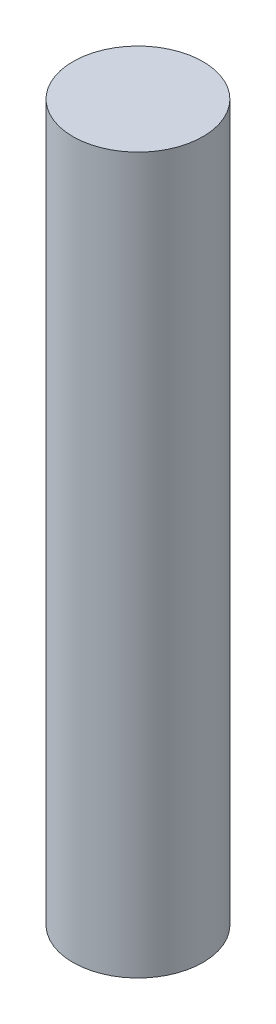
ISO-10303-21;
HEADER;
FILE_DESCRIPTION(('STEP AP214'),'2;1');
FILE_NAME('part.step','',(''),(''),'','','');
FILE_SCHEMA(('AUTOMOTIVE_DESIGN { 1 0 10303 214 1 1 1 1 }'));
ENDSEC;
DATA;
#1=APPLICATION_CONTEXT('core data for automotive mechanical design processes');
#2=APPLICATION_PROTOCOL_DEFINITION('international standard','automotive_design',2000,#1);
#3=PRODUCT_CONTEXT('',#1,'mechanical');
#4=PRODUCT('Part','Part','',(#3));
#5=PRODUCT_RELATED_PRODUCT_CATEGORY('part','',(#4));
#6=PRODUCT_DEFINITION_FORMATION('','',#4);
#7=PRODUCT_DEFINITION_CONTEXT('part definition',#1,'design');
#8=PRODUCT_DEFINITION('design','',#6,#7);
#9=PRODUCT_DEFINITION_SHAPE('','',#8);
#10=(LENGTH_UNIT() NAMED_UNIT(*) SI_UNIT(.MILLI.,.METRE.));
#11=(NAMED_UNIT(*) PLANE_ANGLE_UNIT() SI_UNIT($,.RADIAN.));
#12=(NAMED_UNIT(*) SI_UNIT($,.STERADIAN.) SOLID_ANGLE_UNIT());
#13=UNCERTAINTY_MEASURE_WITH_UNIT(LENGTH_MEASURE(1.E-05),#10,'distance_accuracy_value','');
#14=(GEOMETRIC_REPRESENTATION_CONTEXT(3) GLOBAL_UNCERTAINTY_ASSIGNED_CONTEXT((#13)) GLOBAL_UNIT_ASSIGNED_CONTEXT((#10,
#11,#12)) REPRESENTATION_CONTEXT('',''));
#15=CARTESIAN_POINT('',(0.,0.,0.));
#16=DIRECTION('',(0.,0.,1.));
#17=DIRECTION('',(1.,0.,0.));
#18=AXIS2_PLACEMENT_3D('',#15,#16,#17);
#19=CARTESIAN_POINT('',(0.,16.764,0.));
#20=DIRECTION('',(0.,-1.,0.));
#21=DIRECTION('',(0.,0.,-1.));
#22=AXIS2_PLACEMENT_3D('',#19,#20,#21);
#23=CYLINDRICAL_SURFACE('',#22,1.524);
#24=CARTESIAN_POINT('',(0.,16.764,0.));
#25=DIRECTION('',(0.,1.,0.));
#26=DIRECTION('',(0.,0.,1.));
#27=AXIS2_PLACEMENT_3D('',#24,#25,#26);
#28=CIRCLE('',#27,1.524);
#29=CARTESIAN_POINT('',(0.,16.764,1.524));
#30=VERTEX_POINT('',#29);
#31=EDGE_CURVE('E10',#30,#30,#28,.T.);
#32=ORIENTED_EDGE('',*,*,#31,.F.);
#33=EDGE_LOOP('',(#32));
#34=FACE_BOUND('',#33,.T.);
#35=CARTESIAN_POINT('',(0.,0.,0.));
#36=DIRECTION('',(0.,1.,0.));
#37=DIRECTION('',(0.,0.,1.));
#38=AXIS2_PLACEMENT_3D('',#35,#36,#37);
#39=CIRCLE('',#38,1.524);
#40=CARTESIAN_POINT('',(0.,0.,1.524));
#41=VERTEX_POINT('',#40);
#42=EDGE_CURVE('E37',#41,#41,#39,.T.);
#43=ORIENTED_EDGE('',*,*,#42,.T.);
#44=EDGE_LOOP('',(#43));
#45=FACE_BOUND('',#44,.T.);
#46=ADVANCED_FACE('F34',(#34,#45),#23,.T.);
#47=CARTESIAN_POINT('',(0.,16.764,0.));
#48=DIRECTION('',(0.,1.,0.));
#49=DIRECTION('',(0.,0.,1.));
#50=AXIS2_PLACEMENT_3D('',#47,#48,#49);
#51=PLANE('',#50);
#52=ORIENTED_EDGE('',*,*,#31,.T.);
#53=EDGE_LOOP('',(#52));
#54=FACE_BOUND('',#53,.T.);
#55=ADVANCED_FACE('F49',(#54),#51,.T.);
#56=CARTESIAN_POINT('',(0.,0.,0.));
#57=DIRECTION('',(0.,1.,0.));
#58=DIRECTION('',(0.,0.,1.));
#59=AXIS2_PLACEMENT_3D('',#56,#57,#58);
#60=PLANE('',#59);
#61=ORIENTED_EDGE('',*,*,#42,.F.);
#62=EDGE_LOOP('',(#61));
#63=FACE_BOUND('',#62,.T.);
#64=ADVANCED_FACE('F47',(#63),#60,.F.);
#65=CLOSED_SHELL('',(#46,#55,#64));
#66=MANIFOLD_SOLID_BREP('B2',#65);
#67=ADVANCED_BREP_SHAPE_REPRESENTATION('',(#18,#66),#14);
#68=SHAPE_DEFINITION_REPRESENTATION(#9,#67);
ENDSEC;
END-ISO-10303-21;
